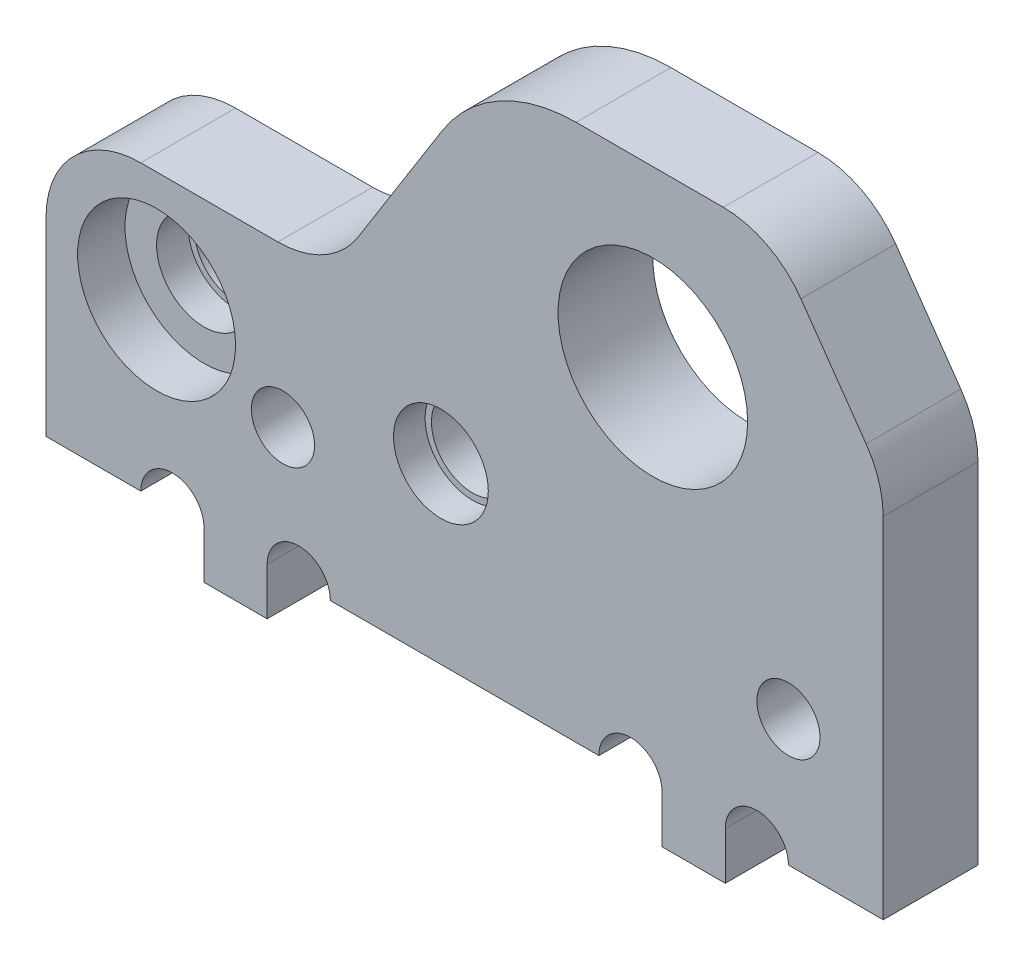
ISO-10303-21;
HEADER;
FILE_DESCRIPTION(('STEP AP214'),'2;1');
FILE_NAME('part.step','',(''),(''),'','','');
FILE_SCHEMA(('AUTOMOTIVE_DESIGN { 1 0 10303 214 1 1 1 1 }'));
ENDSEC;
DATA;
#1=APPLICATION_CONTEXT('core data for automotive mechanical design processes');
#2=APPLICATION_PROTOCOL_DEFINITION('international standard','automotive_design',2000,#1);
#3=PRODUCT_CONTEXT('',#1,'mechanical');
#4=PRODUCT('Part','Part','',(#3));
#5=PRODUCT_RELATED_PRODUCT_CATEGORY('part','',(#4));
#6=PRODUCT_DEFINITION_FORMATION('','',#4);
#7=PRODUCT_DEFINITION_CONTEXT('part definition',#1,'design');
#8=PRODUCT_DEFINITION('design','',#6,#7);
#9=PRODUCT_DEFINITION_SHAPE('','',#8);
#10=(LENGTH_UNIT() NAMED_UNIT(*) SI_UNIT(.MILLI.,.METRE.));
#11=(NAMED_UNIT(*) PLANE_ANGLE_UNIT() SI_UNIT($,.RADIAN.));
#12=(NAMED_UNIT(*) SI_UNIT($,.STERADIAN.) SOLID_ANGLE_UNIT());
#13=UNCERTAINTY_MEASURE_WITH_UNIT(LENGTH_MEASURE(1.E-05),#10,'distance_accuracy_value','');
#14=(GEOMETRIC_REPRESENTATION_CONTEXT(3) GLOBAL_UNCERTAINTY_ASSIGNED_CONTEXT((#13)) GLOBAL_UNIT_ASSIGNED_CONTEXT((#10,
#11,#12)) REPRESENTATION_CONTEXT('',''));
#15=CARTESIAN_POINT('',(0.,0.,0.));
#16=DIRECTION('',(0.,0.,1.));
#17=DIRECTION('',(1.,0.,0.));
#18=AXIS2_PLACEMENT_3D('',#15,#16,#17);
#19=CARTESIAN_POINT('',(0.,0.,0.));
#20=DIRECTION('',(0.,-1.,0.));
#21=DIRECTION('',(0.,0.,-1.));
#22=AXIS2_PLACEMENT_3D('',#19,#20,#21);
#23=PLANE('',#22);
#24=DIRECTION('',(-1.,0.,0.));
#25=VECTOR('',#24,1.);
#26=CARTESIAN_POINT('',(0.,0.,-3.));
#27=LINE('',#26,#25);
#28=CARTESIAN_POINT('',(17.5,0.,-3.));
#29=VERTEX_POINT('',#28);
#30=CARTESIAN_POINT('',(9.,0.,-3.));
#31=VERTEX_POINT('',#30);
#32=EDGE_CURVE('E313',#29,#31,#27,.T.);
#33=ORIENTED_EDGE('',*,*,#32,.F.);
#34=DIRECTION('',(0.,0.,-1.));
#35=VECTOR('',#34,1.);
#36=CARTESIAN_POINT('',(17.5,0.,0.));
#37=LINE('',#36,#35);
#38=CARTESIAN_POINT('',(17.5,0.,0.));
#39=VERTEX_POINT('',#38);
#40=EDGE_CURVE('E357',#39,#29,#37,.T.);
#41=ORIENTED_EDGE('',*,*,#40,.F.);
#42=DIRECTION('',(1.,0.,0.));
#43=VECTOR('',#42,1.);
#44=CARTESIAN_POINT('',(0.,0.,0.));
#45=LINE('',#44,#43);
#46=CARTESIAN_POINT('',(9.,0.,0.));
#47=VERTEX_POINT('',#46);
#48=EDGE_CURVE('E226',#47,#39,#45,.T.);
#49=ORIENTED_EDGE('',*,*,#48,.F.);
#50=DIRECTION('',(0.,0.,-1.));
#51=VECTOR('',#50,1.);
#52=CARTESIAN_POINT('',(9.,0.,0.));
#53=LINE('',#52,#51);
#54=EDGE_CURVE('E360',#31,#47,#53,.F.);
#55=ORIENTED_EDGE('',*,*,#54,.F.);
#56=EDGE_LOOP('',(#33,#41,#49,#55));
#57=FACE_BOUND('',#56,.T.);
#58=ADVANCED_FACE('F35',(#57),#23,.T.);
#59=DIRECTION('',(-1.,0.,0.));
#60=VECTOR('',#59,1.);
#61=CARTESIAN_POINT('',(0.,0.,-3.));
#62=LINE('',#61,#60);
#63=CARTESIAN_POINT('',(26.5,0.,-3.));
#64=VERTEX_POINT('',#63);
#65=CARTESIAN_POINT('',(23.5,0.,-3.));
#66=VERTEX_POINT('',#65);
#67=EDGE_CURVE('E199',#64,#66,#62,.T.);
#68=ORIENTED_EDGE('',*,*,#67,.F.);
#69=DIRECTION('',(0.,0.,-1.));
#70=VECTOR('',#69,1.);
#71=CARTESIAN_POINT('',(26.5,0.,0.));
#72=LINE('',#71,#70);
#73=CARTESIAN_POINT('',(26.5,0.,0.));
#74=VERTEX_POINT('',#73);
#75=EDGE_CURVE('E212',#74,#64,#72,.T.);
#76=ORIENTED_EDGE('',*,*,#75,.F.);
#77=CARTESIAN_POINT('',(23.5,0.,0.));
#78=VERTEX_POINT('',#77);
#79=EDGE_CURVE('E228',#78,#74,#45,.T.);
#80=ORIENTED_EDGE('',*,*,#79,.F.);
#81=DIRECTION('',(0.,0.,-1.));
#82=VECTOR('',#81,1.);
#83=CARTESIAN_POINT('',(23.5,0.,0.));
#84=LINE('',#83,#82);
#85=EDGE_CURVE('E213',#66,#78,#84,.F.);
#86=ORIENTED_EDGE('',*,*,#85,.F.);
#87=EDGE_LOOP('',(#68,#76,#80,#86));
#88=FACE_BOUND('',#87,.T.);
#89=ADVANCED_FACE('F210',(#88),#23,.T.);
#90=DIRECTION('',(-1.,0.,0.));
#91=VECTOR('',#90,1.);
#92=CARTESIAN_POINT('',(0.,0.,-3.));
#93=LINE('',#92,#91);
#94=CARTESIAN_POINT('',(3.,0.,-3.));
#95=VERTEX_POINT('',#94);
#96=CARTESIAN_POINT('',(0.,0.,-3.));
#97=VERTEX_POINT('',#96);
#98=EDGE_CURVE('E305',#95,#97,#93,.T.);
#99=ORIENTED_EDGE('',*,*,#98,.F.);
#100=DIRECTION('',(0.,0.,-1.));
#101=VECTOR('',#100,1.);
#102=CARTESIAN_POINT('',(3.,0.,0.));
#103=LINE('',#102,#101);
#104=CARTESIAN_POINT('',(3.,0.,0.));
#105=VERTEX_POINT('',#104);
#106=EDGE_CURVE('E362',#105,#95,#103,.T.);
#107=ORIENTED_EDGE('',*,*,#106,.F.);
#108=CARTESIAN_POINT('',(0.,0.,0.));
#109=VERTEX_POINT('',#108);
#110=EDGE_CURVE('E222',#109,#105,#45,.T.);
#111=ORIENTED_EDGE('',*,*,#110,.F.);
#112=DIRECTION('',(0.,0.,1.));
#113=VECTOR('',#112,1.);
#114=CARTESIAN_POINT('',(0.,0.,0.));
#115=LINE('',#114,#113);
#116=EDGE_CURVE('E426',#97,#109,#115,.T.);
#117=ORIENTED_EDGE('',*,*,#116,.F.);
#118=EDGE_LOOP('',(#99,#107,#111,#117));
#119=FACE_BOUND('',#118,.T.);
#120=ADVANCED_FACE('F494',(#119),#23,.T.);
#121=CARTESIAN_POINT('',(12.5,5.5,-6.));
#122=DIRECTION('',(0.,0.,1.));
#123=DIRECTION('',(1.,0.,0.));
#124=AXIS2_PLACEMENT_3D('',#121,#122,#123);
#125=CYLINDRICAL_SURFACE('',#124,1.3);
#126=CARTESIAN_POINT('',(12.5,5.5,-3.));
#127=DIRECTION('',(0.,0.,1.));
#128=DIRECTION('',(1.,0.,0.));
#129=AXIS2_PLACEMENT_3D('',#126,#127,#128);
#130=CIRCLE('',#129,1.3);
#131=CARTESIAN_POINT('',(13.8,5.5,-3.));
#132=VERTEX_POINT('',#131);
#133=EDGE_CURVE('E330',#132,#132,#130,.F.);
#134=ORIENTED_EDGE('',*,*,#133,.T.);
#135=EDGE_LOOP('',(#134));
#136=FACE_BOUND('',#135,.T.);
#137=CARTESIAN_POINT('',(12.5,5.5,-1.));
#138=DIRECTION('',(0.,0.,1.));
#139=DIRECTION('',(1.,0.,0.));
#140=AXIS2_PLACEMENT_3D('',#137,#138,#139);
#141=CIRCLE('',#140,1.3);
#142=CARTESIAN_POINT('',(13.8,5.5,-1.));
#143=VERTEX_POINT('',#142);
#144=EDGE_CURVE('E419',#143,#143,#141,.T.);
#145=ORIENTED_EDGE('',*,*,#144,.T.);
#146=EDGE_LOOP('',(#145));
#147=FACE_BOUND('',#146,.T.);
#148=ADVANCED_FACE('F501',(#136,#147),#125,.F.);
#149=CARTESIAN_POINT('',(3.5,5.5,-6.));
#150=DIRECTION('',(0.,0.,1.));
#151=DIRECTION('',(1.,0.,0.));
#152=AXIS2_PLACEMENT_3D('',#149,#150,#151);
#153=CYLINDRICAL_SURFACE('',#152,1.3);
#154=CARTESIAN_POINT('',(3.5,5.5,-3.));
#155=DIRECTION('',(0.,0.,1.));
#156=DIRECTION('',(1.,0.,0.));
#157=AXIS2_PLACEMENT_3D('',#154,#155,#156);
#158=CIRCLE('',#157,1.3);
#159=CARTESIAN_POINT('',(4.8,5.5,-3.));
#160=VERTEX_POINT('',#159);
#161=EDGE_CURVE('E327',#160,#160,#158,.F.);
#162=ORIENTED_EDGE('',*,*,#161,.T.);
#163=EDGE_LOOP('',(#162));
#164=FACE_BOUND('',#163,.T.);
#165=CARTESIAN_POINT('',(3.5,5.5,-2.5));
#166=DIRECTION('',(0.,0.,1.));
#167=DIRECTION('',(1.,0.,0.));
#168=AXIS2_PLACEMENT_3D('',#165,#166,#167);
#169=CIRCLE('',#168,1.3);
#170=CARTESIAN_POINT('',(4.8,5.5,-2.5));
#171=VERTEX_POINT('',#170);
#172=EDGE_CURVE('E401',#171,#171,#169,.T.);
#173=ORIENTED_EDGE('',*,*,#172,.T.);
#174=EDGE_LOOP('',(#173));
#175=FACE_BOUND('',#174,.T.);
#176=ADVANCED_FACE('F506',(#164,#175),#153,.F.);
#177=CARTESIAN_POINT('',(0.,17.,0.));
#178=DIRECTION('',(1.,0.,0.));
#179=DIRECTION('',(0.,0.,-1.));
#180=AXIS2_PLACEMENT_3D('',#177,#178,#179);
#181=PLANE('',#180);
#182=DIRECTION('',(0.,0.,-1.));
#183=VECTOR('',#182,1.);
#184=CARTESIAN_POINT('',(0.,6.,0.));
#185=LINE('',#184,#183);
#186=CARTESIAN_POINT('',(0.,6.,0.));
#187=VERTEX_POINT('',#186);
#188=CARTESIAN_POINT('',(0.,6.,-3.));
#189=VERTEX_POINT('',#188);
#190=EDGE_CURVE('E267',#187,#189,#185,.T.);
#191=ORIENTED_EDGE('',*,*,#190,.T.);
#192=DIRECTION('',(0.,1.,0.));
#193=VECTOR('',#192,1.);
#194=CARTESIAN_POINT('',(0.,-1.5,-3.));
#195=LINE('',#194,#193);
#196=EDGE_CURVE('E51',#97,#189,#195,.T.);
#197=ORIENTED_EDGE('',*,*,#196,.F.);
#198=ORIENTED_EDGE('',*,*,#116,.T.);
#199=DIRECTION('',(0.,-1.,0.));
#200=VECTOR('',#199,1.);
#201=CARTESIAN_POINT('',(0.,17.,0.));
#202=LINE('',#201,#200);
#203=EDGE_CURVE('E232',#187,#109,#202,.T.);
#204=ORIENTED_EDGE('',*,*,#203,.F.);
#205=EDGE_LOOP('',(#191,#197,#198,#204));
#206=FACE_BOUND('',#205,.T.);
#207=ADVANCED_FACE('F273',(#206),#181,.F.);
#208=CARTESIAN_POINT('',(0.,17.,0.));
#209=DIRECTION('',(0.,0.,-1.));
#210=DIRECTION('',(-1.,0.,0.));
#211=AXIS2_PLACEMENT_3D('',#208,#209,#210);
#212=PLANE('',#211);
#213=CARTESIAN_POINT('',(23.5,4.,0.));
#214=DIRECTION('',(0.,0.,-1.));
#215=DIRECTION('',(-1.,0.,0.));
#216=AXIS2_PLACEMENT_3D('',#213,#214,#215);
#217=CIRCLE('',#216,1.);
#218=CARTESIAN_POINT('',(22.5,4.,0.));
#219=VERTEX_POINT('',#218);
#220=EDGE_CURVE('E334',#219,#219,#217,.T.);
#221=ORIENTED_EDGE('',*,*,#220,.T.);
#222=EDGE_LOOP('',(#221));
#223=FACE_BOUND('',#222,.T.);
#224=CARTESIAN_POINT('',(7.5,4.,0.));
#225=DIRECTION('',(0.,0.,-1.));
#226=DIRECTION('',(-1.,0.,0.));
#227=AXIS2_PLACEMENT_3D('',#224,#225,#226);
#228=CIRCLE('',#227,1.);
#229=CARTESIAN_POINT('',(6.5,4.,0.));
#230=VERTEX_POINT('',#229);
#231=EDGE_CURVE('E333',#230,#230,#228,.T.);
#232=ORIENTED_EDGE('',*,*,#231,.T.);
#233=EDGE_LOOP('',(#232));
#234=FACE_BOUND('',#233,.T.);
#235=CARTESIAN_POINT('',(3.5,5.5,0.));
#236=DIRECTION('',(0.,0.,1.));
#237=DIRECTION('',(1.,0.,0.));
#238=AXIS2_PLACEMENT_3D('',#235,#236,#237);
#239=CIRCLE('',#238,2.5);
#240=CARTESIAN_POINT('',(6.,5.5,0.));
#241=VERTEX_POINT('',#240);
#242=EDGE_CURVE('E408',#241,#241,#239,.T.);
#243=ORIENTED_EDGE('',*,*,#242,.F.);
#244=EDGE_LOOP('',(#243));
#245=FACE_BOUND('',#244,.T.);
#246=CARTESIAN_POINT('',(19.2082039324994,11.5,0.));
#247=DIRECTION('',(0.,0.,1.));
#248=DIRECTION('',(1.,0.,0.));
#249=AXIS2_PLACEMENT_3D('',#246,#247,#248);
#250=CIRCLE('',#249,3.);
#251=CARTESIAN_POINT('',(22.2082039324994,11.5,0.));
#252=VERTEX_POINT('',#251);
#253=EDGE_CURVE('E414',#252,#252,#250,.T.);
#254=ORIENTED_EDGE('',*,*,#253,.F.);
#255=EDGE_LOOP('',(#254));
#256=FACE_BOUND('',#255,.T.);
#257=CARTESIAN_POINT('',(12.5,5.5,0.));
#258=DIRECTION('',(0.,0.,1.));
#259=DIRECTION('',(1.,0.,0.));
#260=AXIS2_PLACEMENT_3D('',#257,#258,#259);
#261=CIRCLE('',#260,1.5);
#262=CARTESIAN_POINT('',(14.,5.5,0.));
#263=VERTEX_POINT('',#262);
#264=EDGE_CURVE('E422',#263,#263,#261,.T.);
#265=ORIENTED_EDGE('',*,*,#264,.F.);
#266=EDGE_LOOP('',(#265));
#267=FACE_BOUND('',#266,.T.);
#268=DIRECTION('',(-1.,0.,0.));
#269=VECTOR('',#268,1.);
#270=CARTESIAN_POINT('',(0.,9.,0.));
#271=LINE('',#270,#269);
#272=CARTESIAN_POINT('',(7.33919631394635,9.,0.));
#273=VERTEX_POINT('',#272);
#274=CARTESIAN_POINT('',(3.,9.,0.));
#275=VERTEX_POINT('',#274);
#276=EDGE_CURVE('E342',#273,#275,#271,.T.);
#277=ORIENTED_EDGE('',*,*,#276,.T.);
#278=CARTESIAN_POINT('',(3.,6.,0.));
#279=DIRECTION('',(0.,0.,-1.));
#280=DIRECTION('',(-1.,0.,0.));
#281=AXIS2_PLACEMENT_3D('',#278,#279,#280);
#282=CIRCLE('',#281,3.);
#283=EDGE_CURVE('E11',#275,#187,#282,.F.);
#284=ORIENTED_EDGE('',*,*,#283,.T.);
#285=ORIENTED_EDGE('',*,*,#203,.T.);
#286=ORIENTED_EDGE('',*,*,#110,.T.);
#287=CARTESIAN_POINT('',(4.,0.,0.));
#288=DIRECTION('',(0.,0.,-1.));
#289=DIRECTION('',(-1.,0.,0.));
#290=AXIS2_PLACEMENT_3D('',#287,#288,#289);
#291=CIRCLE('',#290,1.);
#292=CARTESIAN_POINT('',(5.,0.,0.));
#293=VERTEX_POINT('',#292);
#294=EDGE_CURVE('E344',#105,#293,#291,.T.);
#295=ORIENTED_EDGE('',*,*,#294,.T.);
#296=DIRECTION('',(0.,1.,0.));
#297=VECTOR('',#296,1.);
#298=CARTESIAN_POINT('',(5.,-1.5,0.));
#299=LINE('',#298,#297);
#300=CARTESIAN_POINT('',(5.,-1.5,0.));
#301=VERTEX_POINT('',#300);
#302=EDGE_CURVE('E392',#301,#293,#299,.T.);
#303=ORIENTED_EDGE('',*,*,#302,.F.);
#304=DIRECTION('',(-1.,0.,0.));
#305=VECTOR('',#304,1.);
#306=CARTESIAN_POINT('',(5.,-1.5,0.));
#307=LINE('',#306,#305);
#308=CARTESIAN_POINT('',(7.,-1.5,0.));
#309=VERTEX_POINT('',#308);
#310=EDGE_CURVE('E390',#309,#301,#307,.T.);
#311=ORIENTED_EDGE('',*,*,#310,.F.);
#312=DIRECTION('',(0.,1.,0.));
#313=VECTOR('',#312,1.);
#314=CARTESIAN_POINT('',(7.,-1.5,0.));
#315=LINE('',#314,#313);
#316=CARTESIAN_POINT('',(7.,0.,0.));
#317=VERTEX_POINT('',#316);
#318=EDGE_CURVE('E398',#309,#317,#315,.T.);
#319=ORIENTED_EDGE('',*,*,#318,.T.);
#320=CARTESIAN_POINT('',(8.,0.,0.));
#321=DIRECTION('',(0.,0.,-1.));
#322=DIRECTION('',(-1.,0.,0.));
#323=AXIS2_PLACEMENT_3D('',#320,#321,#322);
#324=CIRCLE('',#323,1.);
#325=EDGE_CURVE('E351',#317,#47,#324,.T.);
#326=ORIENTED_EDGE('',*,*,#325,.T.);
#327=ORIENTED_EDGE('',*,*,#48,.T.);
#328=CARTESIAN_POINT('',(18.5,0.,0.));
#329=DIRECTION('',(0.,0.,-1.));
#330=DIRECTION('',(-1.,0.,0.));
#331=AXIS2_PLACEMENT_3D('',#328,#329,#330);
#332=CIRCLE('',#331,1.);
#333=CARTESIAN_POINT('',(19.5,0.,0.));
#334=VERTEX_POINT('',#333);
#335=EDGE_CURVE('E348',#39,#334,#332,.T.);
#336=ORIENTED_EDGE('',*,*,#335,.T.);
#337=DIRECTION('',(0.,1.,0.));
#338=VECTOR('',#337,1.);
#339=CARTESIAN_POINT('',(19.5,-1.5,0.));
#340=LINE('',#339,#338);
#341=CARTESIAN_POINT('',(19.5,-1.5,0.));
#342=VERTEX_POINT('',#341);
#343=EDGE_CURVE('E374',#342,#334,#340,.T.);
#344=ORIENTED_EDGE('',*,*,#343,.F.);
#345=DIRECTION('',(-1.,0.,0.));
#346=VECTOR('',#345,1.);
#347=CARTESIAN_POINT('',(19.5,-1.5,0.));
#348=LINE('',#347,#346);
#349=CARTESIAN_POINT('',(21.5,-1.5,0.));
#350=VERTEX_POINT('',#349);
#351=EDGE_CURVE('E372',#350,#342,#348,.T.);
#352=ORIENTED_EDGE('',*,*,#351,.F.);
#353=DIRECTION('',(0.,1.,0.));
#354=VECTOR('',#353,1.);
#355=CARTESIAN_POINT('',(21.5,-1.5,0.));
#356=LINE('',#355,#354);
#357=CARTESIAN_POINT('',(21.5,0.,0.));
#358=VERTEX_POINT('',#357);
#359=EDGE_CURVE('E380',#350,#358,#356,.T.);
#360=ORIENTED_EDGE('',*,*,#359,.T.);
#361=CARTESIAN_POINT('',(22.5,0.,0.));
#362=DIRECTION('',(0.,0.,-1.));
#363=DIRECTION('',(-1.,0.,0.));
#364=AXIS2_PLACEMENT_3D('',#361,#362,#363);
#365=CIRCLE('',#364,1.);
#366=EDGE_CURVE('E345',#358,#78,#365,.T.);
#367=ORIENTED_EDGE('',*,*,#366,.T.);
#368=ORIENTED_EDGE('',*,*,#79,.T.);
#369=DIRECTION('',(0.,-1.,0.));
#370=VECTOR('',#369,1.);
#371=CARTESIAN_POINT('',(26.5,17.,0.));
#372=LINE('',#371,#370);
#373=CARTESIAN_POINT('',(26.5,11.0543333075427,0.));
#374=VERTEX_POINT('',#373);
#375=EDGE_CURVE('E219',#374,#74,#372,.T.);
#376=ORIENTED_EDGE('',*,*,#375,.F.);
#377=CARTESIAN_POINT('',(23.5,11.0543333075427,0.));
#378=DIRECTION('',(0.,0.,-1.));
#379=DIRECTION('',(-1.,0.,0.));
#380=AXIS2_PLACEMENT_3D('',#377,#378,#379);
#381=CIRCLE('',#380,3.);
#382=CARTESIAN_POINT('',(25.9576957615571,12.7747203406327,0.));
#383=VERTEX_POINT('',#382);
#384=EDGE_CURVE('E243',#374,#383,#381,.F.);
#385=ORIENTED_EDGE('',*,*,#384,.T.);
#386=DIRECTION('',(0.573462344363328,-0.819231920519041,0.));
#387=VECTOR('',#386,1.);
#388=CARTESIAN_POINT('',(23.,17.,0.));
#389=LINE('',#388,#387);
#390=CARTESIAN_POINT('',(23.895729076837,15.72038703309,0.));
#391=VERTEX_POINT('',#390);
#392=EDGE_CURVE('E235',#383,#391,#389,.F.);
#393=ORIENTED_EDGE('',*,*,#392,.T.);
#394=CARTESIAN_POINT('',(21.4380333152799,14.,0.));
#395=DIRECTION('',(0.,0.,-1.));
#396=DIRECTION('',(-1.,0.,0.));
#397=AXIS2_PLACEMENT_3D('',#394,#395,#396);
#398=CIRCLE('',#397,3.);
#399=CARTESIAN_POINT('',(21.4380333152799,17.,0.));
#400=VERTEX_POINT('',#399);
#401=EDGE_CURVE('E240',#391,#400,#398,.F.);
#402=ORIENTED_EDGE('',*,*,#401,.T.);
#403=DIRECTION('',(1.,0.,0.));
#404=VECTOR('',#403,1.);
#405=CARTESIAN_POINT('',(0.,17.,0.));
#406=LINE('',#405,#404);
#407=CARTESIAN_POINT('',(16.779018718282,17.,0.));
#408=VERTEX_POINT('',#407);
#409=EDGE_CURVE('E221',#408,#400,#406,.T.);
#410=ORIENTED_EDGE('',*,*,#409,.F.);
#411=CARTESIAN_POINT('',(16.779018718282,12.,0.));
#412=DIRECTION('',(0.,0.,-1.));
#413=DIRECTION('',(-1.,0.,0.));
#414=AXIS2_PLACEMENT_3D('',#411,#412,#413);
#415=CIRCLE('',#414,5.);
#416=CARTESIAN_POINT('',(12.5416508646635,14.6541879498484,0.));
#417=VERTEX_POINT('',#416);
#418=EDGE_CURVE('E258',#408,#417,#415,.F.);
#419=ORIENTED_EDGE('',*,*,#418,.T.);
#420=DIRECTION('',(-0.530837589969674,-0.847473570723706,0.));
#421=VECTOR('',#420,1.);
#422=CARTESIAN_POINT('',(9.,9.,0.));
#423=LINE('',#422,#421);
#424=CARTESIAN_POINT('',(9.88161702611747,10.407487230091,0.));
#425=VERTEX_POINT('',#424);
#426=EDGE_CURVE('E337',#417,#425,#423,.T.);
#427=ORIENTED_EDGE('',*,*,#426,.T.);
#428=CARTESIAN_POINT('',(7.33919631394635,12.,0.));
#429=DIRECTION('',(0.,0.,-1.));
#430=DIRECTION('',(-1.,0.,0.));
#431=AXIS2_PLACEMENT_3D('',#428,#429,#430);
#432=CIRCLE('',#431,3.);
#433=EDGE_CURVE('E265',#425,#273,#432,.T.);
#434=ORIENTED_EDGE('',*,*,#433,.T.);
#435=EDGE_LOOP('',(#277,#284,#285,#286,#295,#303,#311,#319,#326,#327,#336,#344,#352,#360,#367,
#368,#376,#385,#393,#402,#410,#419,#427,#434));
#436=FACE_BOUND('',#435,.T.);
#437=ADVANCED_FACE('F431',(#223,#234,#245,#256,#267,#436),#212,.F.);
#438=CARTESIAN_POINT('',(26.5,17.,0.));
#439=DIRECTION('',(-1.,0.,0.));
#440=DIRECTION('',(0.,0.,1.));
#441=AXIS2_PLACEMENT_3D('',#438,#439,#440);
#442=PLANE('',#441);
#443=ORIENTED_EDGE('',*,*,#75,.T.);
#444=DIRECTION('',(0.,1.,0.));
#445=VECTOR('',#444,1.);
#446=CARTESIAN_POINT('',(26.5,-1.5,-3.));
#447=LINE('',#446,#445);
#448=CARTESIAN_POINT('',(26.5,11.0543333075427,-3.));
#449=VERTEX_POINT('',#448);
#450=EDGE_CURVE('E195',#64,#449,#447,.T.);
#451=ORIENTED_EDGE('',*,*,#450,.T.);
#452=DIRECTION('',(0.,0.,-1.));
#453=VECTOR('',#452,1.);
#454=CARTESIAN_POINT('',(26.5,11.0543333075427,0.));
#455=LINE('',#454,#453);
#456=EDGE_CURVE('E238',#449,#374,#455,.F.);
#457=ORIENTED_EDGE('',*,*,#456,.T.);
#458=ORIENTED_EDGE('',*,*,#375,.T.);
#459=EDGE_LOOP('',(#443,#451,#457,#458));
#460=FACE_BOUND('',#459,.T.);
#461=ADVANCED_FACE('F217',(#460),#442,.F.);
#462=CARTESIAN_POINT('',(0.,17.,0.));
#463=DIRECTION('',(0.,-1.,0.));
#464=DIRECTION('',(0.,0.,-1.));
#465=AXIS2_PLACEMENT_3D('',#462,#463,#464);
#466=PLANE('',#465);
#467=DIRECTION('',(0.,0.,1.));
#468=VECTOR('',#467,1.);
#469=CARTESIAN_POINT('',(21.4380333152799,17.,-6.));
#470=LINE('',#469,#468);
#471=CARTESIAN_POINT('',(21.4380333152799,17.,-3.));
#472=VERTEX_POINT('',#471);
#473=EDGE_CURVE('E250',#400,#472,#470,.F.);
#474=ORIENTED_EDGE('',*,*,#473,.T.);
#475=DIRECTION('',(1.,0.,0.));
#476=VECTOR('',#475,1.);
#477=CARTESIAN_POINT('',(26.5,17.,-3.));
#478=LINE('',#477,#476);
#479=CARTESIAN_POINT('',(16.779018718282,17.,-3.));
#480=VERTEX_POINT('',#479);
#481=EDGE_CURVE('E457',#480,#472,#478,.T.);
#482=ORIENTED_EDGE('',*,*,#481,.F.);
#483=DIRECTION('',(0.,0.,-1.));
#484=VECTOR('',#483,1.);
#485=CARTESIAN_POINT('',(16.779018718282,17.,0.));
#486=LINE('',#485,#484);
#487=EDGE_CURVE('E256',#480,#408,#486,.F.);
#488=ORIENTED_EDGE('',*,*,#487,.T.);
#489=ORIENTED_EDGE('',*,*,#409,.T.);
#490=EDGE_LOOP('',(#474,#482,#488,#489));
#491=FACE_BOUND('',#490,.T.);
#492=ADVANCED_FACE('F472',(#491),#466,.F.);
#493=CARTESIAN_POINT('',(12.5,5.5,-1.));
#494=DIRECTION('',(0.,0.,1.));
#495=DIRECTION('',(1.,0.,0.));
#496=AXIS2_PLACEMENT_3D('',#493,#494,#495);
#497=CYLINDRICAL_SURFACE('',#496,1.5);
#498=CARTESIAN_POINT('',(12.5,5.5,-1.));
#499=DIRECTION('',(0.,0.,1.));
#500=DIRECTION('',(1.,0.,0.));
#501=AXIS2_PLACEMENT_3D('',#498,#499,#500);
#502=CIRCLE('',#501,1.5);
#503=CARTESIAN_POINT('',(14.,5.5,-1.));
#504=VERTEX_POINT('',#503);
#505=EDGE_CURVE('E423',#504,#504,#502,.T.);
#506=ORIENTED_EDGE('',*,*,#505,.F.);
#507=EDGE_LOOP('',(#506));
#508=FACE_BOUND('',#507,.T.);
#509=ORIENTED_EDGE('',*,*,#264,.T.);
#510=EDGE_LOOP('',(#509));
#511=FACE_BOUND('',#510,.T.);
#512=ADVANCED_FACE('F575',(#508,#511),#497,.F.);
#513=CARTESIAN_POINT('',(12.5,5.5,-1.));
#514=DIRECTION('',(0.,0.,1.));
#515=DIRECTION('',(1.,0.,0.));
#516=AXIS2_PLACEMENT_3D('',#513,#514,#515);
#517=PLANE('',#516);
#518=ORIENTED_EDGE('',*,*,#144,.F.);
#519=EDGE_LOOP('',(#518));
#520=FACE_BOUND('',#519,.T.);
#521=ORIENTED_EDGE('',*,*,#505,.T.);
#522=EDGE_LOOP('',(#521));
#523=FACE_BOUND('',#522,.T.);
#524=ADVANCED_FACE('F570',(#520,#523),#517,.T.);
#525=CARTESIAN_POINT('',(19.2082039324994,11.5,-6.));
#526=DIRECTION('',(0.,0.,1.));
#527=DIRECTION('',(1.,0.,0.));
#528=AXIS2_PLACEMENT_3D('',#525,#526,#527);
#529=CYLINDRICAL_SURFACE('',#528,3.);
#530=CARTESIAN_POINT('',(19.2082039324994,11.5,-3.));
#531=DIRECTION('',(0.,0.,1.));
#532=DIRECTION('',(1.,0.,0.));
#533=AXIS2_PLACEMENT_3D('',#530,#531,#532);
#534=CIRCLE('',#533,3.);
#535=CARTESIAN_POINT('',(22.2082039324994,11.5,-3.));
#536=VERTEX_POINT('',#535);
#537=EDGE_CURVE('E214',#536,#536,#534,.F.);
#538=ORIENTED_EDGE('',*,*,#537,.T.);
#539=EDGE_LOOP('',(#538));
#540=FACE_BOUND('',#539,.T.);
#541=ORIENTED_EDGE('',*,*,#253,.T.);
#542=EDGE_LOOP('',(#541));
#543=FACE_BOUND('',#542,.T.);
#544=ADVANCED_FACE('F567',(#540,#543),#529,.F.);
#545=CARTESIAN_POINT('',(3.5,5.5,-1.5));
#546=DIRECTION('',(0.,0.,1.));
#547=DIRECTION('',(1.,0.,0.));
#548=AXIS2_PLACEMENT_3D('',#545,#546,#547);
#549=CYLINDRICAL_SURFACE('',#548,2.5);
#550=CARTESIAN_POINT('',(3.5,5.5,-1.5));
#551=DIRECTION('',(0.,0.,1.));
#552=DIRECTION('',(1.,0.,0.));
#553=AXIS2_PLACEMENT_3D('',#550,#551,#552);
#554=CIRCLE('',#553,2.5);
#555=CARTESIAN_POINT('',(6.,5.5,-1.5));
#556=VERTEX_POINT('',#555);
#557=EDGE_CURVE('E411',#556,#556,#554,.T.);
#558=ORIENTED_EDGE('',*,*,#557,.F.);
#559=EDGE_LOOP('',(#558));
#560=FACE_BOUND('',#559,.T.);
#561=ORIENTED_EDGE('',*,*,#242,.T.);
#562=EDGE_LOOP('',(#561));
#563=FACE_BOUND('',#562,.T.);
#564=ADVANCED_FACE('F563',(#560,#563),#549,.F.);
#565=CARTESIAN_POINT('',(3.5,5.5,-1.5));
#566=DIRECTION('',(0.,0.,1.));
#567=DIRECTION('',(1.,0.,0.));
#568=AXIS2_PLACEMENT_3D('',#565,#566,#567);
#569=PLANE('',#568);
#570=CARTESIAN_POINT('',(3.5,5.5,-1.5));
#571=DIRECTION('',(0.,0.,1.));
#572=DIRECTION('',(1.,0.,0.));
#573=AXIS2_PLACEMENT_3D('',#570,#571,#572);
#574=CIRCLE('',#573,1.5);
#575=CARTESIAN_POINT('',(5.,5.5,-1.5));
#576=VERTEX_POINT('',#575);
#577=EDGE_CURVE('E404',#576,#576,#574,.T.);
#578=ORIENTED_EDGE('',*,*,#577,.F.);
#579=EDGE_LOOP('',(#578));
#580=FACE_BOUND('',#579,.T.);
#581=ORIENTED_EDGE('',*,*,#557,.T.);
#582=EDGE_LOOP('',(#581));
#583=FACE_BOUND('',#582,.T.);
#584=ADVANCED_FACE('F559',(#580,#583),#569,.T.);
#585=CARTESIAN_POINT('',(3.5,5.5,-2.5));
#586=DIRECTION('',(0.,0.,1.));
#587=DIRECTION('',(1.,0.,0.));
#588=AXIS2_PLACEMENT_3D('',#585,#586,#587);
#589=CYLINDRICAL_SURFACE('',#588,1.5);
#590=CARTESIAN_POINT('',(3.5,5.5,-2.5));
#591=DIRECTION('',(0.,0.,1.));
#592=DIRECTION('',(1.,0.,0.));
#593=AXIS2_PLACEMENT_3D('',#590,#591,#592);
#594=CIRCLE('',#593,1.5);
#595=CARTESIAN_POINT('',(5.,5.5,-2.5));
#596=VERTEX_POINT('',#595);
#597=EDGE_CURVE('E405',#596,#596,#594,.T.);
#598=ORIENTED_EDGE('',*,*,#597,.F.);
#599=EDGE_LOOP('',(#598));
#600=FACE_BOUND('',#599,.T.);
#601=ORIENTED_EDGE('',*,*,#577,.T.);
#602=EDGE_LOOP('',(#601));
#603=FACE_BOUND('',#602,.T.);
#604=ADVANCED_FACE('F555',(#600,#603),#589,.F.);
#605=CARTESIAN_POINT('',(3.5,5.5,-2.5));
#606=DIRECTION('',(0.,0.,1.));
#607=DIRECTION('',(1.,0.,0.));
#608=AXIS2_PLACEMENT_3D('',#605,#606,#607);
#609=PLANE('',#608);
#610=ORIENTED_EDGE('',*,*,#172,.F.);
#611=EDGE_LOOP('',(#610));
#612=FACE_BOUND('',#611,.T.);
#613=ORIENTED_EDGE('',*,*,#597,.T.);
#614=EDGE_LOOP('',(#613));
#615=FACE_BOUND('',#614,.T.);
#616=ADVANCED_FACE('F549',(#612,#615),#609,.T.);
#617=CARTESIAN_POINT('',(5.,-1.5,0.));
#618=DIRECTION('',(1.,0.,0.));
#619=DIRECTION('',(0.,0.,-1.));
#620=AXIS2_PLACEMENT_3D('',#617,#618,#619);
#621=PLANE('',#620);
#622=DIRECTION('',(0.,0.,-1.));
#623=VECTOR('',#622,1.);
#624=CARTESIAN_POINT('',(5.,0.,0.));
#625=LINE('',#624,#623);
#626=CARTESIAN_POINT('',(5.,0.,-3.));
#627=VERTEX_POINT('',#626);
#628=EDGE_CURVE('E383',#293,#627,#625,.T.);
#629=ORIENTED_EDGE('',*,*,#628,.T.);
#630=DIRECTION('',(0.,-1.,0.));
#631=VECTOR('',#630,1.);
#632=CARTESIAN_POINT('',(5.,-1.5,-3.));
#633=LINE('',#632,#631);
#634=CARTESIAN_POINT('',(5.,-1.5,-3.));
#635=VERTEX_POINT('',#634);
#636=EDGE_CURVE('E302',#627,#635,#633,.T.);
#637=ORIENTED_EDGE('',*,*,#636,.T.);
#638=DIRECTION('',(0.,0.,-1.));
#639=VECTOR('',#638,1.);
#640=CARTESIAN_POINT('',(5.,-1.5,0.));
#641=LINE('',#640,#639);
#642=EDGE_CURVE('E384',#301,#635,#641,.T.);
#643=ORIENTED_EDGE('',*,*,#642,.F.);
#644=ORIENTED_EDGE('',*,*,#302,.T.);
#645=EDGE_LOOP('',(#629,#637,#643,#644));
#646=FACE_BOUND('',#645,.T.);
#647=ADVANCED_FACE('F517',(#646),#621,.F.);
#648=CARTESIAN_POINT('',(7.,-1.5,0.));
#649=DIRECTION('',(-1.,0.,0.));
#650=DIRECTION('',(0.,0.,1.));
#651=AXIS2_PLACEMENT_3D('',#648,#649,#650);
#652=PLANE('',#651);
#653=DIRECTION('',(0.,0.,1.));
#654=VECTOR('',#653,1.);
#655=CARTESIAN_POINT('',(7.,-1.5,0.));
#656=LINE('',#655,#654);
#657=CARTESIAN_POINT('',(7.,-1.5,-3.));
#658=VERTEX_POINT('',#657);
#659=EDGE_CURVE('E387',#658,#309,#656,.T.);
#660=ORIENTED_EDGE('',*,*,#659,.F.);
#661=DIRECTION('',(0.,1.,0.));
#662=VECTOR('',#661,1.);
#663=CARTESIAN_POINT('',(7.,-1.5,-3.));
#664=LINE('',#663,#662);
#665=CARTESIAN_POINT('',(7.,0.,-3.));
#666=VERTEX_POINT('',#665);
#667=EDGE_CURVE('E310',#658,#666,#664,.T.);
#668=ORIENTED_EDGE('',*,*,#667,.T.);
#669=DIRECTION('',(0.,0.,1.));
#670=VECTOR('',#669,1.);
#671=CARTESIAN_POINT('',(7.,0.,0.));
#672=LINE('',#671,#670);
#673=EDGE_CURVE('E388',#666,#317,#672,.T.);
#674=ORIENTED_EDGE('',*,*,#673,.T.);
#675=ORIENTED_EDGE('',*,*,#318,.F.);
#676=EDGE_LOOP('',(#660,#668,#674,#675));
#677=FACE_BOUND('',#676,.T.);
#678=ADVANCED_FACE('F523',(#677),#652,.F.);
#679=CARTESIAN_POINT('',(0.,-1.5,0.));
#680=DIRECTION('',(0.,-1.,0.));
#681=DIRECTION('',(0.,0.,-1.));
#682=AXIS2_PLACEMENT_3D('',#679,#680,#681);
#683=PLANE('',#682);
#684=DIRECTION('',(1.,0.,0.));
#685=VECTOR('',#684,1.);
#686=CARTESIAN_POINT('',(26.5,-1.5,-3.));
#687=LINE('',#686,#685);
#688=EDGE_CURVE('E456',#635,#658,#687,.T.);
#689=ORIENTED_EDGE('',*,*,#688,.T.);
#690=ORIENTED_EDGE('',*,*,#659,.T.);
#691=ORIENTED_EDGE('',*,*,#310,.T.);
#692=ORIENTED_EDGE('',*,*,#642,.T.);
#693=EDGE_LOOP('',(#689,#690,#691,#692));
#694=FACE_BOUND('',#693,.T.);
#695=ADVANCED_FACE('F519',(#694),#683,.T.);
#696=CARTESIAN_POINT('',(19.5,-1.5,0.));
#697=DIRECTION('',(1.,0.,0.));
#698=DIRECTION('',(0.,0.,-1.));
#699=AXIS2_PLACEMENT_3D('',#696,#697,#698);
#700=PLANE('',#699);
#701=DIRECTION('',(0.,0.,-1.));
#702=VECTOR('',#701,1.);
#703=CARTESIAN_POINT('',(19.5,0.,0.));
#704=LINE('',#703,#702);
#705=CARTESIAN_POINT('',(19.5,0.,-3.));
#706=VERTEX_POINT('',#705);
#707=EDGE_CURVE('E365',#334,#706,#704,.T.);
#708=ORIENTED_EDGE('',*,*,#707,.T.);
#709=DIRECTION('',(0.,-1.,0.));
#710=VECTOR('',#709,1.);
#711=CARTESIAN_POINT('',(19.5,-1.5,-3.));
#712=LINE('',#711,#710);
#713=CARTESIAN_POINT('',(19.5,-1.5,-3.));
#714=VERTEX_POINT('',#713);
#715=EDGE_CURVE('E318',#706,#714,#712,.T.);
#716=ORIENTED_EDGE('',*,*,#715,.T.);
#717=DIRECTION('',(0.,0.,-1.));
#718=VECTOR('',#717,1.);
#719=CARTESIAN_POINT('',(19.5,-1.5,0.));
#720=LINE('',#719,#718);
#721=EDGE_CURVE('E366',#342,#714,#720,.T.);
#722=ORIENTED_EDGE('',*,*,#721,.F.);
#723=ORIENTED_EDGE('',*,*,#343,.T.);
#724=EDGE_LOOP('',(#708,#716,#722,#723));
#725=FACE_BOUND('',#724,.T.);
#726=ADVANCED_FACE('F441',(#725),#700,.F.);
#727=CARTESIAN_POINT('',(21.5,-1.5,0.));
#728=DIRECTION('',(-1.,0.,0.));
#729=DIRECTION('',(0.,0.,1.));
#730=AXIS2_PLACEMENT_3D('',#727,#728,#729);
#731=PLANE('',#730);
#732=DIRECTION('',(0.,0.,1.));
#733=VECTOR('',#732,1.);
#734=CARTESIAN_POINT('',(21.5,-1.5,0.));
#735=LINE('',#734,#733);
#736=CARTESIAN_POINT('',(21.5,-1.5,-3.));
#737=VERTEX_POINT('',#736);
#738=EDGE_CURVE('E369',#737,#350,#735,.T.);
#739=ORIENTED_EDGE('',*,*,#738,.F.);
#740=DIRECTION('',(0.,1.,0.));
#741=VECTOR('',#740,1.);
#742=CARTESIAN_POINT('',(21.5,-1.5,-3.));
#743=LINE('',#742,#741);
#744=CARTESIAN_POINT('',(21.5,0.,-3.));
#745=VERTEX_POINT('',#744);
#746=EDGE_CURVE('E215',#737,#745,#743,.T.);
#747=ORIENTED_EDGE('',*,*,#746,.T.);
#748=DIRECTION('',(0.,0.,1.));
#749=VECTOR('',#748,1.);
#750=CARTESIAN_POINT('',(21.5,0.,0.));
#751=LINE('',#750,#749);
#752=EDGE_CURVE('E370',#745,#358,#751,.T.);
#753=ORIENTED_EDGE('',*,*,#752,.T.);
#754=ORIENTED_EDGE('',*,*,#359,.F.);
#755=EDGE_LOOP('',(#739,#747,#753,#754));
#756=FACE_BOUND('',#755,.T.);
#757=ADVANCED_FACE('F451',(#756),#731,.F.);
#758=CARTESIAN_POINT('',(0.,-1.5,0.));
#759=DIRECTION('',(0.,-1.,0.));
#760=DIRECTION('',(0.,0.,-1.));
#761=AXIS2_PLACEMENT_3D('',#758,#759,#760);
#762=PLANE('',#761);
#763=EDGE_CURVE('E449',#714,#737,#687,.T.);
#764=ORIENTED_EDGE('',*,*,#763,.T.);
#765=ORIENTED_EDGE('',*,*,#738,.T.);
#766=ORIENTED_EDGE('',*,*,#351,.T.);
#767=ORIENTED_EDGE('',*,*,#721,.T.);
#768=EDGE_LOOP('',(#764,#765,#766,#767));
#769=FACE_BOUND('',#768,.T.);
#770=ADVANCED_FACE('F447',(#769),#762,.T.);
#771=CARTESIAN_POINT('',(22.5,0.,0.));
#772=DIRECTION('',(0.,0.,-1.));
#773=DIRECTION('',(-1.,0.,0.));
#774=AXIS2_PLACEMENT_3D('',#771,#772,#773);
#775=CYLINDRICAL_SURFACE('',#774,1.);
#776=ORIENTED_EDGE('',*,*,#752,.F.);
#777=CARTESIAN_POINT('',(22.5,0.,-3.));
#778=DIRECTION('',(0.,0.,1.));
#779=DIRECTION('',(1.,0.,0.));
#780=AXIS2_PLACEMENT_3D('',#777,#778,#779);
#781=CIRCLE('',#780,1.);
#782=EDGE_CURVE('E321',#745,#66,#781,.F.);
#783=ORIENTED_EDGE('',*,*,#782,.T.);
#784=ORIENTED_EDGE('',*,*,#85,.T.);
#785=ORIENTED_EDGE('',*,*,#366,.F.);
#786=EDGE_LOOP('',(#776,#783,#784,#785));
#787=FACE_BOUND('',#786,.T.);
#788=ADVANCED_FACE('F455',(#787),#775,.F.);
#789=CARTESIAN_POINT('',(18.5,0.,0.));
#790=DIRECTION('',(0.,0.,-1.));
#791=DIRECTION('',(-1.,0.,0.));
#792=AXIS2_PLACEMENT_3D('',#789,#790,#791);
#793=CYLINDRICAL_SURFACE('',#792,1.);
#794=ORIENTED_EDGE('',*,*,#40,.T.);
#795=CARTESIAN_POINT('',(18.5,0.,-3.));
#796=DIRECTION('',(0.,0.,1.));
#797=DIRECTION('',(1.,0.,0.));
#798=AXIS2_PLACEMENT_3D('',#795,#796,#797);
#799=CIRCLE('',#798,1.);
#800=EDGE_CURVE('E315',#29,#706,#799,.F.);
#801=ORIENTED_EDGE('',*,*,#800,.T.);
#802=ORIENTED_EDGE('',*,*,#707,.F.);
#803=ORIENTED_EDGE('',*,*,#335,.F.);
#804=EDGE_LOOP('',(#794,#801,#802,#803));
#805=FACE_BOUND('',#804,.T.);
#806=ADVANCED_FACE('F439',(#805),#793,.F.);
#807=CARTESIAN_POINT('',(8.,0.,0.));
#808=DIRECTION('',(0.,0.,-1.));
#809=DIRECTION('',(-1.,0.,0.));
#810=AXIS2_PLACEMENT_3D('',#807,#808,#809);
#811=CYLINDRICAL_SURFACE('',#810,1.);
#812=ORIENTED_EDGE('',*,*,#673,.F.);
#813=CARTESIAN_POINT('',(8.,0.,-3.));
#814=DIRECTION('',(0.,0.,1.));
#815=DIRECTION('',(1.,0.,0.));
#816=AXIS2_PLACEMENT_3D('',#813,#814,#815);
#817=CIRCLE('',#816,1.);
#818=EDGE_CURVE('E307',#666,#31,#817,.F.);
#819=ORIENTED_EDGE('',*,*,#818,.T.);
#820=ORIENTED_EDGE('',*,*,#54,.T.);
#821=ORIENTED_EDGE('',*,*,#325,.F.);
#822=EDGE_LOOP('',(#812,#819,#820,#821));
#823=FACE_BOUND('',#822,.T.);
#824=ADVANCED_FACE('F526',(#823),#811,.F.);
#825=CARTESIAN_POINT('',(4.,0.,0.));
#826=DIRECTION('',(0.,0.,-1.));
#827=DIRECTION('',(-1.,0.,0.));
#828=AXIS2_PLACEMENT_3D('',#825,#826,#827);
#829=CYLINDRICAL_SURFACE('',#828,1.);
#830=ORIENTED_EDGE('',*,*,#106,.T.);
#831=CARTESIAN_POINT('',(4.,0.,-3.));
#832=DIRECTION('',(0.,0.,1.));
#833=DIRECTION('',(1.,0.,0.));
#834=AXIS2_PLACEMENT_3D('',#831,#832,#833);
#835=CIRCLE('',#834,1.);
#836=EDGE_CURVE('E299',#95,#627,#835,.F.);
#837=ORIENTED_EDGE('',*,*,#836,.T.);
#838=ORIENTED_EDGE('',*,*,#628,.F.);
#839=ORIENTED_EDGE('',*,*,#294,.F.);
#840=EDGE_LOOP('',(#830,#837,#838,#839));
#841=FACE_BOUND('',#840,.T.);
#842=ADVANCED_FACE('F490',(#841),#829,.F.);
#843=CARTESIAN_POINT('',(23.,17.,0.));
#844=DIRECTION('',(-0.819231920519041,-0.573462344363328,0.));
#845=DIRECTION('',(0.,0.,-1.));
#846=AXIS2_PLACEMENT_3D('',#843,#844,#845);
#847=PLANE('',#846);
#848=DIRECTION('',(-0.573462344363328,0.819231920519041,0.));
#849=VECTOR('',#848,1.);
#850=CARTESIAN_POINT('',(23.,17.,-3.));
#851=LINE('',#850,#849);
#852=CARTESIAN_POINT('',(23.895729076837,15.72038703309,-3.));
#853=VERTEX_POINT('',#852);
#854=CARTESIAN_POINT('',(25.9576957615571,12.7747203406327,-3.));
#855=VERTEX_POINT('',#854);
#856=EDGE_CURVE('E296',#853,#855,#851,.F.);
#857=ORIENTED_EDGE('',*,*,#856,.F.);
#858=DIRECTION('',(0.,0.,-1.));
#859=VECTOR('',#858,1.);
#860=CARTESIAN_POINT('',(23.895729076837,15.72038703309,0.));
#861=LINE('',#860,#859);
#862=EDGE_CURVE('E245',#853,#391,#861,.F.);
#863=ORIENTED_EDGE('',*,*,#862,.T.);
#864=ORIENTED_EDGE('',*,*,#392,.F.);
#865=DIRECTION('',(0.,0.,1.));
#866=VECTOR('',#865,1.);
#867=CARTESIAN_POINT('',(25.9576957615571,12.7747203406327,-6.));
#868=LINE('',#867,#866);
#869=EDGE_CURVE('E247',#383,#855,#868,.F.);
#870=ORIENTED_EDGE('',*,*,#869,.T.);
#871=EDGE_LOOP('',(#857,#863,#864,#870));
#872=FACE_BOUND('',#871,.T.);
#873=ADVANCED_FACE('F479',(#872),#847,.F.);
#874=CARTESIAN_POINT('',(23.5,11.0543333075427,0.));
#875=DIRECTION('',(0.,0.,1.));
#876=DIRECTION('',(1.,0.,0.));
#877=AXIS2_PLACEMENT_3D('',#874,#875,#876);
#878=CYLINDRICAL_SURFACE('',#877,3.);
#879=CARTESIAN_POINT('',(23.5,11.0543333075427,-3.));
#880=DIRECTION('',(0.,0.,1.));
#881=DIRECTION('',(1.,0.,0.));
#882=AXIS2_PLACEMENT_3D('',#879,#880,#881);
#883=CIRCLE('',#882,3.);
#884=EDGE_CURVE('E202',#855,#449,#883,.F.);
#885=ORIENTED_EDGE('',*,*,#884,.F.);
#886=ORIENTED_EDGE('',*,*,#869,.F.);
#887=ORIENTED_EDGE('',*,*,#384,.F.);
#888=ORIENTED_EDGE('',*,*,#456,.F.);
#889=EDGE_LOOP('',(#885,#886,#887,#888));
#890=FACE_BOUND('',#889,.T.);
#891=ADVANCED_FACE('F481',(#890),#878,.T.);
#892=CARTESIAN_POINT('',(21.4380333152799,14.,0.));
#893=DIRECTION('',(0.,0.,-1.));
#894=DIRECTION('',(-1.,0.,0.));
#895=AXIS2_PLACEMENT_3D('',#892,#893,#894);
#896=CYLINDRICAL_SURFACE('',#895,3.);
#897=CARTESIAN_POINT('',(21.4380333152799,14.,-3.));
#898=DIRECTION('',(0.,0.,1.));
#899=DIRECTION('',(1.,0.,0.));
#900=AXIS2_PLACEMENT_3D('',#897,#898,#899);
#901=CIRCLE('',#900,3.);
#902=EDGE_CURVE('E294',#472,#853,#901,.F.);
#903=ORIENTED_EDGE('',*,*,#902,.F.);
#904=ORIENTED_EDGE('',*,*,#473,.F.);
#905=ORIENTED_EDGE('',*,*,#401,.F.);
#906=ORIENTED_EDGE('',*,*,#862,.F.);
#907=EDGE_LOOP('',(#903,#904,#905,#906));
#908=FACE_BOUND('',#907,.T.);
#909=ADVANCED_FACE('F470',(#908),#896,.T.);
#910=CARTESIAN_POINT('',(0.,9.,0.));
#911=DIRECTION('',(0.,-1.,0.));
#912=DIRECTION('',(1.,0.,0.));
#913=AXIS2_PLACEMENT_3D('',#910,#911,#912);
#914=PLANE('',#913);
#915=DIRECTION('',(0.,0.,-1.));
#916=VECTOR('',#915,1.);
#917=CARTESIAN_POINT('',(7.33919631394635,9.,-6.));
#918=LINE('',#917,#916);
#919=CARTESIAN_POINT('',(7.33919631394635,9.,-3.));
#920=VERTEX_POINT('',#919);
#921=EDGE_CURVE('E260',#273,#920,#918,.T.);
#922=ORIENTED_EDGE('',*,*,#921,.T.);
#923=DIRECTION('',(-1.,0.,0.));
#924=VECTOR('',#923,1.);
#925=CARTESIAN_POINT('',(0.,9.,-3.));
#926=LINE('',#925,#924);
#927=CARTESIAN_POINT('',(3.,9.,-3.));
#928=VERTEX_POINT('',#927);
#929=EDGE_CURVE('E278',#920,#928,#926,.T.);
#930=ORIENTED_EDGE('',*,*,#929,.T.);
#931=DIRECTION('',(0.,0.,-1.));
#932=VECTOR('',#931,1.);
#933=CARTESIAN_POINT('',(3.,9.,0.));
#934=LINE('',#933,#932);
#935=EDGE_CURVE('E44',#928,#275,#934,.F.);
#936=ORIENTED_EDGE('',*,*,#935,.T.);
#937=ORIENTED_EDGE('',*,*,#276,.F.);
#938=EDGE_LOOP('',(#922,#930,#936,#937));
#939=FACE_BOUND('',#938,.T.);
#940=ADVANCED_FACE('F488',(#939),#914,.F.);
#941=CARTESIAN_POINT('',(9.,9.,0.));
#942=DIRECTION('',(0.847473570723706,-0.530837589969674,0.));
#943=DIRECTION('',(0.530837589969674,0.847473570723706,0.));
#944=AXIS2_PLACEMENT_3D('',#941,#942,#943);
#945=PLANE('',#944);
#946=DIRECTION('',(0.,0.,-1.));
#947=VECTOR('',#946,1.);
#948=CARTESIAN_POINT('',(12.5416508646635,14.6541879498484,0.));
#949=LINE('',#948,#947);
#950=CARTESIAN_POINT('',(12.5416508646635,14.6541879498484,-3.));
#951=VERTEX_POINT('',#950);
#952=EDGE_CURVE('E253',#417,#951,#949,.T.);
#953=ORIENTED_EDGE('',*,*,#952,.T.);
#954=DIRECTION('',(-0.530837589969674,-0.847473570723706,0.));
#955=VECTOR('',#954,1.);
#956=CARTESIAN_POINT('',(9.,9.,-3.));
#957=LINE('',#956,#955);
#958=CARTESIAN_POINT('',(9.88161702611747,10.407487230091,-3.));
#959=VERTEX_POINT('',#958);
#960=EDGE_CURVE('E289',#951,#959,#957,.T.);
#961=ORIENTED_EDGE('',*,*,#960,.T.);
#962=DIRECTION('',(0.,0.,-1.));
#963=VECTOR('',#962,1.);
#964=CARTESIAN_POINT('',(9.88161702611747,10.407487230091,0.));
#965=LINE('',#964,#963);
#966=EDGE_CURVE('E263',#959,#425,#965,.F.);
#967=ORIENTED_EDGE('',*,*,#966,.T.);
#968=ORIENTED_EDGE('',*,*,#426,.F.);
#969=EDGE_LOOP('',(#953,#961,#967,#968));
#970=FACE_BOUND('',#969,.T.);
#971=ADVANCED_FACE('F730',(#970),#945,.F.);
#972=CARTESIAN_POINT('',(16.779018718282,12.,0.));
#973=DIRECTION('',(0.,0.,-1.));
#974=DIRECTION('',(-1.,0.,0.));
#975=AXIS2_PLACEMENT_3D('',#972,#973,#974);
#976=CYLINDRICAL_SURFACE('',#975,5.);
#977=CARTESIAN_POINT('',(16.779018718282,12.,-3.));
#978=DIRECTION('',(0.,0.,1.));
#979=DIRECTION('',(1.,0.,0.));
#980=AXIS2_PLACEMENT_3D('',#977,#978,#979);
#981=CIRCLE('',#980,5.);
#982=EDGE_CURVE('E292',#951,#480,#981,.F.);
#983=ORIENTED_EDGE('',*,*,#982,.F.);
#984=ORIENTED_EDGE('',*,*,#952,.F.);
#985=ORIENTED_EDGE('',*,*,#418,.F.);
#986=ORIENTED_EDGE('',*,*,#487,.F.);
#987=EDGE_LOOP('',(#983,#984,#985,#986));
#988=FACE_BOUND('',#987,.T.);
#989=ADVANCED_FACE('F739',(#988),#976,.T.);
#990=CARTESIAN_POINT('',(7.33919631394635,12.,0.));
#991=DIRECTION('',(0.,0.,1.));
#992=DIRECTION('',(1.,0.,0.));
#993=AXIS2_PLACEMENT_3D('',#990,#991,#992);
#994=CYLINDRICAL_SURFACE('',#993,3.);
#995=ORIENTED_EDGE('',*,*,#966,.F.);
#996=CARTESIAN_POINT('',(7.33919631394635,12.,-3.));
#997=DIRECTION('',(0.,0.,1.));
#998=DIRECTION('',(1.,0.,0.));
#999=AXIS2_PLACEMENT_3D('',#996,#997,#998);
#1000=CIRCLE('',#999,3.);
#1001=EDGE_CURVE('E281',#959,#920,#1000,.F.);
#1002=ORIENTED_EDGE('',*,*,#1001,.T.);
#1003=ORIENTED_EDGE('',*,*,#921,.F.);
#1004=ORIENTED_EDGE('',*,*,#433,.F.);
#1005=EDGE_LOOP('',(#995,#1002,#1003,#1004));
#1006=FACE_BOUND('',#1005,.T.);
#1007=ADVANCED_FACE('F749',(#1006),#994,.F.);
#1008=CARTESIAN_POINT('',(3.,6.,0.));
#1009=DIRECTION('',(0.,0.,-1.));
#1010=DIRECTION('',(-1.,0.,0.));
#1011=AXIS2_PLACEMENT_3D('',#1008,#1009,#1010);
#1012=CYLINDRICAL_SURFACE('',#1011,3.);
#1013=CARTESIAN_POINT('',(3.,6.,-3.));
#1014=DIRECTION('',(0.,0.,1.));
#1015=DIRECTION('',(1.,0.,0.));
#1016=AXIS2_PLACEMENT_3D('',#1013,#1014,#1015);
#1017=CIRCLE('',#1016,3.);
#1018=EDGE_CURVE('E277',#189,#928,#1017,.F.);
#1019=ORIENTED_EDGE('',*,*,#1018,.F.);
#1020=ORIENTED_EDGE('',*,*,#190,.F.);
#1021=ORIENTED_EDGE('',*,*,#283,.F.);
#1022=ORIENTED_EDGE('',*,*,#935,.F.);
#1023=EDGE_LOOP('',(#1019,#1020,#1021,#1022));
#1024=FACE_BOUND('',#1023,.T.);
#1025=ADVANCED_FACE('F37',(#1024),#1012,.T.);
#1026=CARTESIAN_POINT('',(7.5,4.,0.));
#1027=DIRECTION('',(0.,0.,-1.));
#1028=DIRECTION('',(-1.,0.,0.));
#1029=AXIS2_PLACEMENT_3D('',#1026,#1027,#1028);
#1030=CYLINDRICAL_SURFACE('',#1029,1.);
#1031=CARTESIAN_POINT('',(7.5,4.,-3.));
#1032=DIRECTION('',(0.,0.,1.));
#1033=DIRECTION('',(1.,0.,0.));
#1034=AXIS2_PLACEMENT_3D('',#1031,#1032,#1033);
#1035=CIRCLE('',#1034,1.);
#1036=CARTESIAN_POINT('',(8.5,4.,-3.));
#1037=VERTEX_POINT('',#1036);
#1038=EDGE_CURVE('E279',#1037,#1037,#1035,.F.);
#1039=ORIENTED_EDGE('',*,*,#1038,.T.);
#1040=EDGE_LOOP('',(#1039));
#1041=FACE_BOUND('',#1040,.T.);
#1042=ORIENTED_EDGE('',*,*,#231,.F.);
#1043=EDGE_LOOP('',(#1042));
#1044=FACE_BOUND('',#1043,.T.);
#1045=ADVANCED_FACE('F767',(#1041,#1044),#1030,.F.);
#1046=CARTESIAN_POINT('',(23.5,4.,0.));
#1047=DIRECTION('',(0.,0.,-1.));
#1048=DIRECTION('',(-1.,0.,0.));
#1049=AXIS2_PLACEMENT_3D('',#1046,#1047,#1048);
#1050=CYLINDRICAL_SURFACE('',#1049,1.);
#1051=CARTESIAN_POINT('',(23.5,4.,-3.));
#1052=DIRECTION('',(0.,0.,1.));
#1053=DIRECTION('',(1.,0.,0.));
#1054=AXIS2_PLACEMENT_3D('',#1051,#1052,#1053);
#1055=CIRCLE('',#1054,1.);
#1056=CARTESIAN_POINT('',(24.5,4.,-3.));
#1057=VERTEX_POINT('',#1056);
#1058=EDGE_CURVE('E39',#1057,#1057,#1055,.F.);
#1059=ORIENTED_EDGE('',*,*,#1058,.T.);
#1060=EDGE_LOOP('',(#1059));
#1061=FACE_BOUND('',#1060,.T.);
#1062=ORIENTED_EDGE('',*,*,#220,.F.);
#1063=EDGE_LOOP('',(#1062));
#1064=FACE_BOUND('',#1063,.T.);
#1065=ADVANCED_FACE('F775',(#1061,#1064),#1050,.F.);
#1066=CARTESIAN_POINT('',(26.5,-1.5,-3.));
#1067=DIRECTION('',(0.,0.,1.));
#1068=DIRECTION('',(1.,0.,0.));
#1069=AXIS2_PLACEMENT_3D('',#1066,#1067,#1068);
#1070=PLANE('',#1069);
#1071=ORIENTED_EDGE('',*,*,#161,.F.);
#1072=EDGE_LOOP('',(#1071));
#1073=FACE_BOUND('',#1072,.T.);
#1074=ORIENTED_EDGE('',*,*,#1038,.F.);
#1075=EDGE_LOOP('',(#1074));
#1076=FACE_BOUND('',#1075,.T.);
#1077=ORIENTED_EDGE('',*,*,#1058,.F.);
#1078=EDGE_LOOP('',(#1077));
#1079=FACE_BOUND('',#1078,.T.);
#1080=ORIENTED_EDGE('',*,*,#67,.T.);
#1081=ORIENTED_EDGE('',*,*,#782,.F.);
#1082=ORIENTED_EDGE('',*,*,#746,.F.);
#1083=ORIENTED_EDGE('',*,*,#763,.F.);
#1084=ORIENTED_EDGE('',*,*,#715,.F.);
#1085=ORIENTED_EDGE('',*,*,#800,.F.);
#1086=ORIENTED_EDGE('',*,*,#32,.T.);
#1087=ORIENTED_EDGE('',*,*,#818,.F.);
#1088=ORIENTED_EDGE('',*,*,#667,.F.);
#1089=ORIENTED_EDGE('',*,*,#688,.F.);
#1090=ORIENTED_EDGE('',*,*,#636,.F.);
#1091=ORIENTED_EDGE('',*,*,#836,.F.);
#1092=ORIENTED_EDGE('',*,*,#98,.T.);
#1093=ORIENTED_EDGE('',*,*,#196,.T.);
#1094=ORIENTED_EDGE('',*,*,#1018,.T.);
#1095=ORIENTED_EDGE('',*,*,#929,.F.);
#1096=ORIENTED_EDGE('',*,*,#1001,.F.);
#1097=ORIENTED_EDGE('',*,*,#960,.F.);
#1098=ORIENTED_EDGE('',*,*,#982,.T.);
#1099=ORIENTED_EDGE('',*,*,#481,.T.);
#1100=ORIENTED_EDGE('',*,*,#902,.T.);
#1101=ORIENTED_EDGE('',*,*,#856,.T.);
#1102=ORIENTED_EDGE('',*,*,#884,.T.);
#1103=ORIENTED_EDGE('',*,*,#450,.F.);
#1104=EDGE_LOOP('',(#1080,#1081,#1082,#1083,#1084,#1085,#1086,#1087,#1088,#1089,#1090,#1091,
#1092,#1093,#1094,#1095,#1096,#1097,#1098,#1099,#1100,#1101,#1102,#1103));
#1105=FACE_BOUND('',#1104,.T.);
#1106=ORIENTED_EDGE('',*,*,#537,.F.);
#1107=EDGE_LOOP('',(#1106));
#1108=FACE_BOUND('',#1107,.T.);
#1109=ORIENTED_EDGE('',*,*,#133,.F.);
#1110=EDGE_LOOP('',(#1109));
#1111=FACE_BOUND('',#1110,.T.);
#1112=ADVANCED_FACE('F197',(#1073,#1076,#1079,#1105,#1108,#1111),#1070,.F.);
#1113=CLOSED_SHELL('',(#58,#89,#120,#148,#176,#207,#437,#461,#492,#512,#524,#544,#564,#584,#604,
#616,#647,#678,#695,#726,#757,#770,#788,#806,#824,#842,#873,#891,#909,#940,#971,#989,#1007,
#1025,#1045,#1065,#1112));
#1114=MANIFOLD_SOLID_BREP('B2',#1113);
#1115=ADVANCED_BREP_SHAPE_REPRESENTATION('',(#18,#1114),#14);
#1116=SHAPE_DEFINITION_REPRESENTATION(#9,#1115);
ENDSEC;
END-ISO-10303-21;
